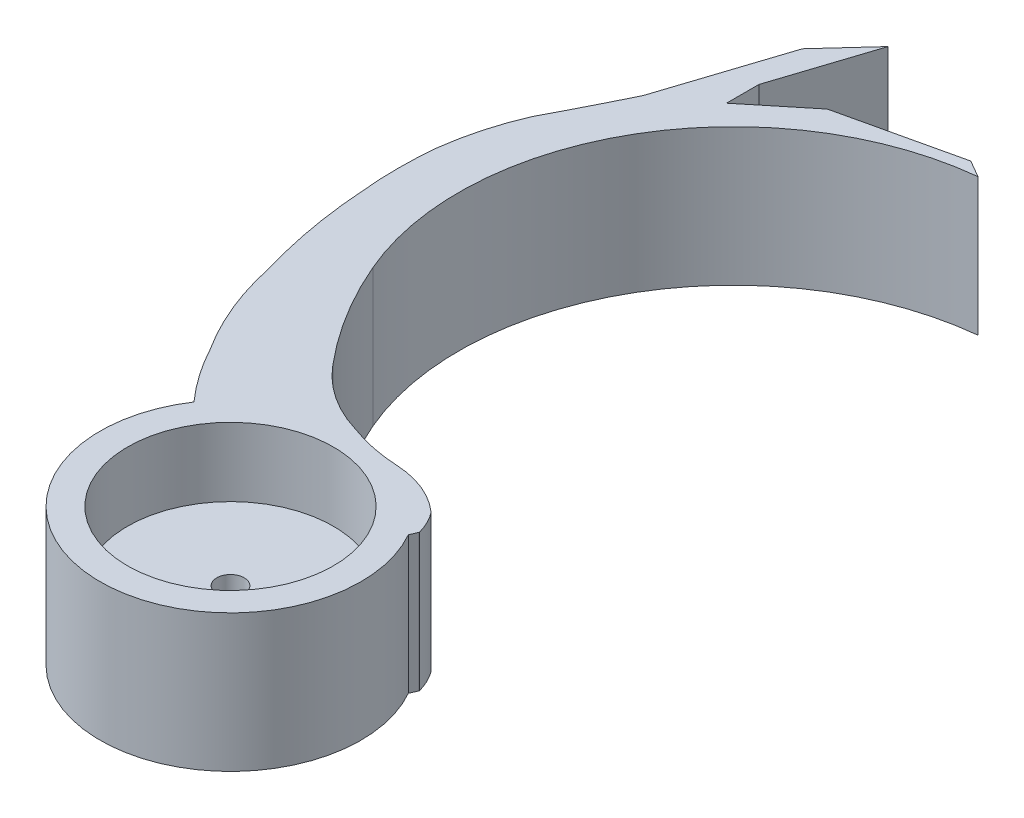
ISO-10303-21;
HEADER;
FILE_DESCRIPTION(('STEP AP214'),'2;1');
FILE_NAME('part.step','',(''),(''),'','','');
FILE_SCHEMA(('AUTOMOTIVE_DESIGN { 1 0 10303 214 1 1 1 1 }'));
ENDSEC;
DATA;
#1=APPLICATION_CONTEXT('core data for automotive mechanical design processes');
#2=APPLICATION_PROTOCOL_DEFINITION('international standard','automotive_design',2000,#1);
#3=PRODUCT_CONTEXT('',#1,'mechanical');
#4=PRODUCT('Part','Part','',(#3));
#5=PRODUCT_RELATED_PRODUCT_CATEGORY('part','',(#4));
#6=PRODUCT_DEFINITION_FORMATION('','',#4);
#7=PRODUCT_DEFINITION_CONTEXT('part definition',#1,'design');
#8=PRODUCT_DEFINITION('design','',#6,#7);
#9=PRODUCT_DEFINITION_SHAPE('','',#8);
#10=(LENGTH_UNIT() NAMED_UNIT(*) SI_UNIT(.MILLI.,.METRE.));
#11=(NAMED_UNIT(*) PLANE_ANGLE_UNIT() SI_UNIT($,.RADIAN.));
#12=(NAMED_UNIT(*) SI_UNIT($,.STERADIAN.) SOLID_ANGLE_UNIT());
#13=UNCERTAINTY_MEASURE_WITH_UNIT(LENGTH_MEASURE(1.E-05),#10,'distance_accuracy_value','');
#14=(GEOMETRIC_REPRESENTATION_CONTEXT(3) GLOBAL_UNCERTAINTY_ASSIGNED_CONTEXT((#13)) GLOBAL_UNIT_ASSIGNED_CONTEXT((#10,
#11,#12)) REPRESENTATION_CONTEXT('',''));
#15=CARTESIAN_POINT('',(0.,0.,0.));
#16=DIRECTION('',(0.,0.,1.));
#17=DIRECTION('',(1.,0.,0.));
#18=AXIS2_PLACEMENT_3D('',#15,#16,#17);
#19=CARTESIAN_POINT('',(-12.8437990591443,10.,27.2611896073278));
#20=DIRECTION('',(0.,-1.,0.));
#21=DIRECTION('',(0.,0.,-1.));
#22=AXIS2_PLACEMENT_3D('',#19,#20,#21);
#23=CYLINDRICAL_SURFACE('',#22,1.);
#24=CARTESIAN_POINT('',(-12.8437990591443,0.,27.2611896073278));
#25=DIRECTION('',(0.,1.,0.));
#26=DIRECTION('',(0.,0.,1.));
#27=AXIS2_PLACEMENT_3D('',#24,#25,#26);
#28=CIRCLE('',#27,1.);
#29=CARTESIAN_POINT('',(-12.8437990591443,0.,28.2611896073278));
#30=VERTEX_POINT('',#29);
#31=EDGE_CURVE('E261',#30,#30,#28,.T.);
#32=ORIENTED_EDGE('',*,*,#31,.F.);
#33=EDGE_LOOP('',(#32));
#34=FACE_BOUND('',#33,.T.);
#35=CARTESIAN_POINT('',(-12.8437990591443,5.,27.2611896073278));
#36=DIRECTION('',(0.,1.,0.));
#37=DIRECTION('',(0.,0.,1.));
#38=AXIS2_PLACEMENT_3D('',#35,#36,#37);
#39=CIRCLE('',#38,1.);
#40=CARTESIAN_POINT('',(-12.8437990591443,5.,28.2611896073278));
#41=VERTEX_POINT('',#40);
#42=EDGE_CURVE('E39',#41,#41,#39,.T.);
#43=ORIENTED_EDGE('',*,*,#42,.T.);
#44=EDGE_LOOP('',(#43));
#45=FACE_BOUND('',#44,.T.);
#46=ADVANCED_FACE('F35',(#34,#45),#23,.F.);
#47=CARTESIAN_POINT('',(-20.2142413349629,10.,0.));
#48=DIRECTION('',(1.,0.,0.));
#49=DIRECTION('',(0.,0.,-1.));
#50=AXIS2_PLACEMENT_3D('',#47,#48,#49);
#51=PLANE('',#50);
#52=DIRECTION('',(0.,0.,1.));
#53=VECTOR('',#52,1.);
#54=CARTESIAN_POINT('',(-20.2142413349629,0.,0.));
#55=LINE('',#54,#53);
#56=CARTESIAN_POINT('',(-20.2142413349629,0.,-18.5820088699334));
#57=VERTEX_POINT('',#56);
#58=CARTESIAN_POINT('',(-20.2142413349629,0.,-16.2231725935429));
#59=VERTEX_POINT('',#58);
#60=EDGE_CURVE('E213',#57,#59,#55,.T.);
#61=ORIENTED_EDGE('',*,*,#60,.F.);
#62=DIRECTION('',(0.,-1.,0.));
#63=VECTOR('',#62,1.);
#64=CARTESIAN_POINT('',(-20.2142413349629,10.,-18.5820088699334));
#65=LINE('',#64,#63);
#66=CARTESIAN_POINT('',(-20.2142413349629,10.,-18.5820088699334));
#67=VERTEX_POINT('',#66);
#68=EDGE_CURVE('E11',#67,#57,#65,.T.);
#69=ORIENTED_EDGE('',*,*,#68,.F.);
#70=DIRECTION('',(0.,0.,1.));
#71=VECTOR('',#70,1.);
#72=CARTESIAN_POINT('',(-20.2142413349629,10.,0.));
#73=LINE('',#72,#71);
#74=CARTESIAN_POINT('',(-20.2142413349629,10.,-16.2231725935429));
#75=VERTEX_POINT('',#74);
#76=EDGE_CURVE('E264',#67,#75,#73,.T.);
#77=ORIENTED_EDGE('',*,*,#76,.T.);
#78=DIRECTION('',(0.,-1.,0.));
#79=VECTOR('',#78,1.);
#80=CARTESIAN_POINT('',(-20.2142413349629,10.,-16.2231725935429));
#81=LINE('',#80,#79);
#82=EDGE_CURVE('E129',#75,#59,#81,.T.);
#83=ORIENTED_EDGE('',*,*,#82,.T.);
#84=EDGE_LOOP('',(#61,#69,#77,#83));
#85=FACE_BOUND('',#84,.T.);
#86=ADVANCED_FACE('F37',(#85),#51,.T.);
#87=CARTESIAN_POINT('',(-23.7471866779469,10.,-7.73368275087385));
#88=DIRECTION('',(0.9508473764207,0.,0.30965992112941));
#89=DIRECTION('',(0.30965992112941,0.,-0.9508473764207));
#90=AXIS2_PLACEMENT_3D('',#87,#88,#89);
#91=PLANE('',#90);
#92=DIRECTION('',(-0.30965992112941,0.,0.9508473764207));
#93=VECTOR('',#92,1.);
#94=CARTESIAN_POINT('',(-23.7471866779469,0.,-7.73368275087385));
#95=LINE('',#94,#93);
#96=CARTESIAN_POINT('',(-17.9037086364288,0.,-25.676772527182));
#97=VERTEX_POINT('',#96);
#98=EDGE_CURVE('E216',#97,#57,#95,.T.);
#99=ORIENTED_EDGE('',*,*,#98,.F.);
#100=DIRECTION('',(0.,-1.,0.));
#101=VECTOR('',#100,1.);
#102=CARTESIAN_POINT('',(-17.9037086364288,10.,-25.676772527182));
#103=LINE('',#102,#101);
#104=CARTESIAN_POINT('',(-17.9037086364288,10.,-25.676772527182));
#105=VERTEX_POINT('',#104);
#106=EDGE_CURVE('E45',#105,#97,#103,.T.);
#107=ORIENTED_EDGE('',*,*,#106,.F.);
#108=DIRECTION('',(-0.30965992112941,0.,0.9508473764207));
#109=VECTOR('',#108,1.);
#110=CARTESIAN_POINT('',(-23.7471866779469,10.,-7.73368275087385));
#111=LINE('',#110,#109);
#112=EDGE_CURVE('E330',#105,#67,#111,.T.);
#113=ORIENTED_EDGE('',*,*,#112,.T.);
#114=ORIENTED_EDGE('',*,*,#68,.T.);
#115=EDGE_LOOP('',(#99,#107,#113,#114));
#116=FACE_BOUND('',#115,.T.);
#117=ADVANCED_FACE('F329',(#116),#91,.T.);
#118=CARTESIAN_POINT('',(-22.5451132045827,10.,-20.5961675466554));
#119=DIRECTION('',(0.738297960081065,0.,0.674474700889617));
#120=DIRECTION('',(0.674474700889617,0.,-0.738297960081065));
#121=AXIS2_PLACEMENT_3D('',#118,#119,#120);
#122=PLANE('',#121);
#123=DIRECTION('',(-0.674474700889617,0.,0.738297960081065));
#124=VECTOR('',#123,1.);
#125=CARTESIAN_POINT('',(-22.5451132045827,0.,-20.5961675466554));
#126=LINE('',#125,#124);
#127=CARTESIAN_POINT('',(-20.8793273548735,0.,-22.4195810759546));
#128=VERTEX_POINT('',#127);
#129=EDGE_CURVE('E219',#97,#128,#126,.T.);
#130=ORIENTED_EDGE('',*,*,#129,.T.);
#131=DIRECTION('',(0.,-1.,0.));
#132=VECTOR('',#131,1.);
#133=CARTESIAN_POINT('',(-20.8793273548735,10.,-22.4195810759546));
#134=LINE('',#133,#132);
#135=CARTESIAN_POINT('',(-20.8793273548735,10.,-22.4195810759546));
#136=VERTEX_POINT('',#135);
#137=EDGE_CURVE('E311',#136,#128,#134,.T.);
#138=ORIENTED_EDGE('',*,*,#137,.F.);
#139=DIRECTION('',(-0.674474700889617,0.,0.738297960081065));
#140=VECTOR('',#139,1.);
#141=CARTESIAN_POINT('',(-22.5451132045827,10.,-20.5961675466554));
#142=LINE('',#141,#140);
#143=EDGE_CURVE('E319',#105,#136,#142,.T.);
#144=ORIENTED_EDGE('',*,*,#143,.F.);
#145=ORIENTED_EDGE('',*,*,#106,.T.);
#146=EDGE_LOOP('',(#130,#138,#144,#145));
#147=FACE_BOUND('',#146,.T.);
#148=ADVANCED_FACE('F317',(#147),#122,.F.);
#149=CARTESIAN_POINT('',(-25.4784302516431,10.,-8.29749221365467));
#150=DIRECTION('',(0.950847376420703,0.,0.309659921129401));
#151=DIRECTION('',(0.309659921129401,0.,-0.950847376420702));
#152=AXIS2_PLACEMENT_3D('',#149,#150,#151);
#153=PLANE('',#152);
#154=DIRECTION('',(-0.309659921129401,0.,0.950847376420703));
#155=VECTOR('',#154,1.);
#156=CARTESIAN_POINT('',(-25.4784302516431,0.,-8.29749221365467));
#157=LINE('',#156,#155);
#158=CARTESIAN_POINT('',(-23.7260144435206,0.,-13.678492013287));
#159=VERTEX_POINT('',#158);
#160=EDGE_CURVE('E221',#128,#159,#157,.T.);
#161=ORIENTED_EDGE('',*,*,#160,.T.);
#162=DIRECTION('',(0.,-1.,0.));
#163=VECTOR('',#162,1.);
#164=CARTESIAN_POINT('',(-23.7260144435206,10.,-13.678492013287));
#165=LINE('',#164,#163);
#166=CARTESIAN_POINT('',(-23.7260144435206,10.,-13.678492013287));
#167=VERTEX_POINT('',#166);
#168=EDGE_CURVE('E308',#167,#159,#165,.T.);
#169=ORIENTED_EDGE('',*,*,#168,.F.);
#170=DIRECTION('',(-0.309659921129401,0.,0.950847376420703));
#171=VECTOR('',#170,1.);
#172=CARTESIAN_POINT('',(-25.4784302516431,10.,-8.29749221365467));
#173=LINE('',#172,#171);
#174=EDGE_CURVE('E339',#136,#167,#173,.T.);
#175=ORIENTED_EDGE('',*,*,#174,.F.);
#176=ORIENTED_EDGE('',*,*,#137,.T.);
#177=EDGE_LOOP('',(#161,#169,#175,#176));
#178=FACE_BOUND('',#177,.T.);
#179=ADVANCED_FACE('F443',(#178),#153,.F.);
#180=CARTESIAN_POINT('',(-176.392216070509,10.,-87.6034124748544));
#181=DIRECTION('',(0.,-1.,0.));
#182=DIRECTION('',(0.,0.,-1.));
#183=AXIS2_PLACEMENT_3D('',#180,#181,#182);
#184=CYLINDRICAL_SURFACE('',#183,169.622707750057);
#185=CARTESIAN_POINT('',(-176.392216070509,0.,-87.6034124748544));
#186=DIRECTION('',(0.,1.,0.));
#187=DIRECTION('',(0.,0.,1.));
#188=AXIS2_PLACEMENT_3D('',#185,#186,#187);
#189=CIRCLE('',#188,169.622707750057);
#190=CARTESIAN_POINT('',(-26.4444092567074,0.,-8.30953997393434));
#191=VERTEX_POINT('',#190);
#192=EDGE_CURVE('E223',#159,#191,#189,.F.);
#193=ORIENTED_EDGE('',*,*,#192,.T.);
#194=DIRECTION('',(0.,-1.,0.));
#195=VECTOR('',#194,1.);
#196=CARTESIAN_POINT('',(-26.4444092567074,10.,-8.30953997393434));
#197=LINE('',#196,#195);
#198=CARTESIAN_POINT('',(-26.4444092567074,10.,-8.30953997393434));
#199=VERTEX_POINT('',#198);
#200=EDGE_CURVE('E305',#199,#191,#197,.T.);
#201=ORIENTED_EDGE('',*,*,#200,.F.);
#202=CARTESIAN_POINT('',(-176.392216070509,10.,-87.6034124748544));
#203=DIRECTION('',(0.,1.,0.));
#204=DIRECTION('',(0.,0.,1.));
#205=AXIS2_PLACEMENT_3D('',#202,#203,#204);
#206=CIRCLE('',#205,169.622707750057);
#207=EDGE_CURVE('E341',#167,#199,#206,.F.);
#208=ORIENTED_EDGE('',*,*,#207,.F.);
#209=ORIENTED_EDGE('',*,*,#168,.T.);
#210=EDGE_LOOP('',(#193,#201,#208,#209));
#211=FACE_BOUND('',#210,.T.);
#212=ADVANCED_FACE('F438',(#211),#184,.F.);
#213=CARTESIAN_POINT('',(-7.95665330887578,10.,-0.323804662988942));
#214=DIRECTION('',(0.,-1.,0.));
#215=DIRECTION('',(0.,0.,-1.));
#216=AXIS2_PLACEMENT_3D('',#213,#214,#215);
#217=CYLINDRICAL_SURFACE('',#216,20.1387459501098);
#218=CARTESIAN_POINT('',(-7.95665330887578,0.,-0.323804662988942));
#219=DIRECTION('',(0.,1.,0.));
#220=DIRECTION('',(0.,0.,1.));
#221=AXIS2_PLACEMENT_3D('',#218,#219,#220);
#222=CIRCLE('',#221,20.1387459501098);
#223=CARTESIAN_POINT('',(-27.9369455661082,0.,-2.8451157819588));
#224=VERTEX_POINT('',#223);
#225=EDGE_CURVE('E225',#191,#224,#222,.T.);
#226=ORIENTED_EDGE('',*,*,#225,.T.);
#227=DIRECTION('',(0.,-1.,0.));
#228=VECTOR('',#227,1.);
#229=CARTESIAN_POINT('',(-27.9369455661082,10.,-2.8451157819588));
#230=LINE('',#229,#228);
#231=CARTESIAN_POINT('',(-27.9369455661082,10.,-2.8451157819588));
#232=VERTEX_POINT('',#231);
#233=EDGE_CURVE('E302',#232,#224,#230,.T.);
#234=ORIENTED_EDGE('',*,*,#233,.F.);
#235=CARTESIAN_POINT('',(-7.95665330887578,10.,-0.323804662988942));
#236=DIRECTION('',(0.,1.,0.));
#237=DIRECTION('',(0.,0.,1.));
#238=AXIS2_PLACEMENT_3D('',#235,#236,#237);
#239=CIRCLE('',#238,20.1387459501098);
#240=EDGE_CURVE('E343',#199,#232,#239,.T.);
#241=ORIENTED_EDGE('',*,*,#240,.F.);
#242=ORIENTED_EDGE('',*,*,#200,.T.);
#243=EDGE_LOOP('',(#226,#234,#241,#242));
#244=FACE_BOUND('',#243,.T.);
#245=ADVANCED_FACE('F435',(#244),#217,.T.);
#246=CARTESIAN_POINT('',(-0.916574408994741,10.,-0.180490640112039));
#247=DIRECTION('',(0.,-1.,0.));
#248=DIRECTION('',(0.,0.,-1.));
#249=AXIS2_PLACEMENT_3D('',#246,#247,#248);
#250=CYLINDRICAL_SURFACE('',#249,27.1514398258129);
#251=CARTESIAN_POINT('',(-0.916574408994741,0.,-0.180490640112039));
#252=DIRECTION('',(0.,1.,0.));
#253=DIRECTION('',(0.,0.,1.));
#254=AXIS2_PLACEMENT_3D('',#251,#252,#253);
#255=CIRCLE('',#254,27.1514398258129);
#256=CARTESIAN_POINT('',(-27.9369455661084,0.,2.48413450173422));
#257=VERTEX_POINT('',#256);
#258=EDGE_CURVE('E227',#224,#257,#255,.T.);
#259=ORIENTED_EDGE('',*,*,#258,.T.);
#260=DIRECTION('',(0.,-1.,0.));
#261=VECTOR('',#260,1.);
#262=CARTESIAN_POINT('',(-27.9369455661084,10.,2.48413450173422));
#263=LINE('',#262,#261);
#264=CARTESIAN_POINT('',(-27.9369455661084,10.,2.48413450173422));
#265=VERTEX_POINT('',#264);
#266=EDGE_CURVE('E299',#265,#257,#263,.T.);
#267=ORIENTED_EDGE('',*,*,#266,.F.);
#268=CARTESIAN_POINT('',(-0.916574408994741,10.,-0.180490640112039));
#269=DIRECTION('',(0.,1.,0.));
#270=DIRECTION('',(0.,0.,1.));
#271=AXIS2_PLACEMENT_3D('',#268,#269,#270);
#272=CIRCLE('',#271,27.1514398258129);
#273=EDGE_CURVE('E345',#232,#265,#272,.T.);
#274=ORIENTED_EDGE('',*,*,#273,.F.);
#275=ORIENTED_EDGE('',*,*,#233,.T.);
#276=EDGE_LOOP('',(#259,#267,#274,#275));
#277=FACE_BOUND('',#276,.T.);
#278=ADVANCED_FACE('F431',(#277),#250,.T.);
#279=CARTESIAN_POINT('',(10.0269760816482,10.,0.0435951776764512));
#280=DIRECTION('',(0.,-1.,0.));
#281=DIRECTION('',(0.,0.,-1.));
#282=AXIS2_PLACEMENT_3D('',#279,#280,#281);
#283=CYLINDRICAL_SURFACE('',#282,38.0422867223999);
#284=CARTESIAN_POINT('',(10.0269760816482,0.,0.0435951776764512));
#285=DIRECTION('',(0.,1.,0.));
#286=DIRECTION('',(0.,0.,1.));
#287=AXIS2_PLACEMENT_3D('',#284,#285,#286);
#288=CIRCLE('',#287,38.0422867223999);
#289=CARTESIAN_POINT('',(-26.4444092567078,0.,10.8627277940387));
#290=VERTEX_POINT('',#289);
#291=EDGE_CURVE('E229',#257,#290,#288,.T.);
#292=ORIENTED_EDGE('',*,*,#291,.T.);
#293=DIRECTION('',(0.,-1.,0.));
#294=VECTOR('',#293,1.);
#295=CARTESIAN_POINT('',(-26.4444092567078,10.,10.8627277940387));
#296=LINE('',#295,#294);
#297=CARTESIAN_POINT('',(-26.4444092567078,10.,10.8627277940387));
#298=VERTEX_POINT('',#297);
#299=EDGE_CURVE('E296',#298,#290,#296,.T.);
#300=ORIENTED_EDGE('',*,*,#299,.F.);
#301=CARTESIAN_POINT('',(10.0269760816482,10.,0.0435951776764512));
#302=DIRECTION('',(0.,1.,0.));
#303=DIRECTION('',(0.,0.,1.));
#304=AXIS2_PLACEMENT_3D('',#301,#302,#303);
#305=CIRCLE('',#304,38.0422867223999);
#306=EDGE_CURVE('E347',#265,#298,#305,.T.);
#307=ORIENTED_EDGE('',*,*,#306,.F.);
#308=ORIENTED_EDGE('',*,*,#266,.T.);
#309=EDGE_LOOP('',(#292,#300,#307,#308));
#310=FACE_BOUND('',#309,.T.);
#311=ADVANCED_FACE('F426',(#310),#283,.T.);
#312=CARTESIAN_POINT('',(-5.33895266715763,10.,6.45705183034006));
#313=DIRECTION('',(0.,-1.,0.));
#314=DIRECTION('',(0.,0.,-1.));
#315=AXIS2_PLACEMENT_3D('',#312,#313,#314);
#316=CYLINDRICAL_SURFACE('',#315,21.5603867903734);
#317=CARTESIAN_POINT('',(-5.33895266715763,0.,6.45705183034006));
#318=DIRECTION('',(0.,1.,0.));
#319=DIRECTION('',(0.,0.,1.));
#320=AXIS2_PLACEMENT_3D('',#317,#318,#319);
#321=CIRCLE('',#320,21.5603867903734);
#322=CARTESIAN_POINT('',(-23.488374838759,0.,18.0952971185049));
#323=VERTEX_POINT('',#322);
#324=EDGE_CURVE('E231',#290,#323,#321,.T.);
#325=ORIENTED_EDGE('',*,*,#324,.T.);
#326=DIRECTION('',(0.,-1.,0.));
#327=VECTOR('',#326,1.);
#328=CARTESIAN_POINT('',(-23.488374838759,10.,18.0952971185049));
#329=LINE('',#328,#327);
#330=CARTESIAN_POINT('',(-23.488374838759,10.,18.0952971185049));
#331=VERTEX_POINT('',#330);
#332=EDGE_CURVE('E293',#331,#323,#329,.T.);
#333=ORIENTED_EDGE('',*,*,#332,.F.);
#334=CARTESIAN_POINT('',(-5.33895266715763,10.,6.45705183034006));
#335=DIRECTION('',(0.,1.,0.));
#336=DIRECTION('',(0.,0.,1.));
#337=AXIS2_PLACEMENT_3D('',#334,#335,#336);
#338=CIRCLE('',#337,21.5603867903734);
#339=EDGE_CURVE('E349',#298,#331,#338,.T.);
#340=ORIENTED_EDGE('',*,*,#339,.F.);
#341=ORIENTED_EDGE('',*,*,#299,.T.);
#342=EDGE_LOOP('',(#325,#333,#340,#341));
#343=FACE_BOUND('',#342,.T.);
#344=ADVANCED_FACE('F420',(#343),#316,.T.);
#345=CARTESIAN_POINT('',(-5.56875548128325,10.,8.49444290633343));
#346=DIRECTION('',(0.,-1.,0.));
#347=DIRECTION('',(0.,0.,-1.));
#348=AXIS2_PLACEMENT_3D('',#345,#346,#347);
#349=CYLINDRICAL_SURFACE('',#348,20.3295144929773);
#350=CARTESIAN_POINT('',(-5.56875548128325,0.,8.49444290633343));
#351=DIRECTION('',(0.,1.,0.));
#352=DIRECTION('',(0.,0.,1.));
#353=AXIS2_PLACEMENT_3D('',#350,#351,#352);
#354=CIRCLE('',#353,20.3295144929773);
#355=CARTESIAN_POINT('',(-20.7581369778164,0.,22.0063579916554));
#356=VERTEX_POINT('',#355);
#357=EDGE_CURVE('E233',#323,#356,#354,.T.);
#358=ORIENTED_EDGE('',*,*,#357,.T.);
#359=DIRECTION('',(0.,-1.,0.));
#360=VECTOR('',#359,1.);
#361=CARTESIAN_POINT('',(-20.7581369778164,10.,22.0063579916554));
#362=LINE('',#361,#360);
#363=CARTESIAN_POINT('',(-20.7581369778164,10.,22.0063579916554));
#364=VERTEX_POINT('',#363);
#365=EDGE_CURVE('E290',#364,#356,#362,.T.);
#366=ORIENTED_EDGE('',*,*,#365,.F.);
#367=CARTESIAN_POINT('',(-5.56875548128325,10.,8.49444290633343));
#368=DIRECTION('',(0.,1.,0.));
#369=DIRECTION('',(0.,0.,1.));
#370=AXIS2_PLACEMENT_3D('',#367,#368,#369);
#371=CIRCLE('',#370,20.3295144929773);
#372=EDGE_CURVE('E351',#331,#364,#371,.T.);
#373=ORIENTED_EDGE('',*,*,#372,.F.);
#374=ORIENTED_EDGE('',*,*,#332,.T.);
#375=EDGE_LOOP('',(#358,#366,#373,#374));
#376=FACE_BOUND('',#375,.T.);
#377=ADVANCED_FACE('F416',(#376),#349,.T.);
#378=CARTESIAN_POINT('',(-12.8437990591443,10.,27.2611896073278));
#379=DIRECTION('',(0.,-1.,0.));
#380=DIRECTION('',(0.,0.,-1.));
#381=AXIS2_PLACEMENT_3D('',#378,#379,#380);
#382=CYLINDRICAL_SURFACE('',#381,9.5);
#383=CARTESIAN_POINT('',(-12.8437990591443,0.,27.2611896073278));
#384=DIRECTION('',(0.,1.,0.));
#385=DIRECTION('',(0.,0.,1.));
#386=AXIS2_PLACEMENT_3D('',#383,#384,#385);
#387=CIRCLE('',#386,9.5);
#388=CARTESIAN_POINT('',(-4.58227795542284,0.,22.5710649764928));
#389=VERTEX_POINT('',#388);
#390=EDGE_CURVE('E235',#356,#389,#387,.T.);
#391=ORIENTED_EDGE('',*,*,#390,.T.);
#392=DIRECTION('',(0.,-1.,0.));
#393=VECTOR('',#392,1.);
#394=CARTESIAN_POINT('',(-4.58227795542284,10.,22.5710649764928));
#395=LINE('',#394,#393);
#396=CARTESIAN_POINT('',(-4.58227795542284,10.,22.5710649764928));
#397=VERTEX_POINT('',#396);
#398=EDGE_CURVE('E288',#397,#389,#395,.T.);
#399=ORIENTED_EDGE('',*,*,#398,.F.);
#400=CARTESIAN_POINT('',(-12.8437990591443,10.,27.2611896073278));
#401=DIRECTION('',(0.,1.,0.));
#402=DIRECTION('',(0.,0.,1.));
#403=AXIS2_PLACEMENT_3D('',#400,#401,#402);
#404=CIRCLE('',#403,9.5);
#405=EDGE_CURVE('E353',#364,#397,#404,.T.);
#406=ORIENTED_EDGE('',*,*,#405,.F.);
#407=ORIENTED_EDGE('',*,*,#365,.T.);
#408=EDGE_LOOP('',(#391,#399,#406,#407));
#409=FACE_BOUND('',#408,.T.);
#410=ADVANCED_FACE('F411',(#409),#382,.T.);
#411=CARTESIAN_POINT('',(-16.7025769365448,10.,16.9703090290826));
#412=DIRECTION('',(0.,-1.,0.));
#413=DIRECTION('',(0.,0.,-1.));
#414=AXIS2_PLACEMENT_3D('',#411,#412,#413);
#415=CYLINDRICAL_SURFACE('',#414,13.3517831982937);
#416=CARTESIAN_POINT('',(-16.7025769365448,0.,16.9703090290826));
#417=DIRECTION('',(0.,1.,0.));
#418=DIRECTION('',(0.,0.,1.));
#419=AXIS2_PLACEMENT_3D('',#416,#417,#418);
#420=CIRCLE('',#419,13.3517831982937);
#421=CARTESIAN_POINT('',(-4.34456964084055,0.,22.0249870854535));
#422=VERTEX_POINT('',#421);
#423=EDGE_CURVE('E238',#422,#389,#420,.F.);
#424=ORIENTED_EDGE('',*,*,#423,.F.);
#425=DIRECTION('',(0.,-1.,0.));
#426=VECTOR('',#425,1.);
#427=CARTESIAN_POINT('',(-4.34456964084055,10.,22.0249870854535));
#428=LINE('',#427,#426);
#429=CARTESIAN_POINT('',(-4.34456964084055,10.,22.0249870854535));
#430=VERTEX_POINT('',#429);
#431=EDGE_CURVE('E286',#430,#422,#428,.T.);
#432=ORIENTED_EDGE('',*,*,#431,.F.);
#433=CARTESIAN_POINT('',(-16.7025769365448,10.,16.9703090290826));
#434=DIRECTION('',(0.,1.,0.));
#435=DIRECTION('',(0.,0.,1.));
#436=AXIS2_PLACEMENT_3D('',#433,#434,#435);
#437=CIRCLE('',#436,13.3517831982937);
#438=EDGE_CURVE('E355',#430,#397,#437,.F.);
#439=ORIENTED_EDGE('',*,*,#438,.T.);
#440=ORIENTED_EDGE('',*,*,#398,.T.);
#441=EDGE_LOOP('',(#424,#432,#439,#440));
#442=FACE_BOUND('',#441,.T.);
#443=ADVANCED_FACE('F405',(#442),#415,.T.);
#444=CARTESIAN_POINT('',(0.367767222361646,10.,23.2869671122719));
#445=DIRECTION('',(0.,-1.,0.));
#446=DIRECTION('',(0.,0.,-1.));
#447=AXIS2_PLACEMENT_3D('',#444,#445,#446);
#448=CYLINDRICAL_SURFACE('',#447,4.8783923889313);
#449=CARTESIAN_POINT('',(0.367767222361646,0.,23.2869671122719));
#450=DIRECTION('',(0.,1.,0.));
#451=DIRECTION('',(0.,0.,1.));
#452=AXIS2_PLACEMENT_3D('',#449,#450,#451);
#453=CIRCLE('',#452,4.8783923889313);
#454=CARTESIAN_POINT('',(-4.33738459962014,0.,21.9984568746392));
#455=VERTEX_POINT('',#454);
#456=EDGE_CURVE('E241',#422,#455,#453,.F.);
#457=ORIENTED_EDGE('',*,*,#456,.T.);
#458=DIRECTION('',(0.,-1.,0.));
#459=VECTOR('',#458,1.);
#460=CARTESIAN_POINT('',(-4.33738459962014,10.,21.9984568746392));
#461=LINE('',#460,#459);
#462=CARTESIAN_POINT('',(-4.33738459962014,10.,21.9984568746392));
#463=VERTEX_POINT('',#462);
#464=EDGE_CURVE('E283',#463,#455,#461,.T.);
#465=ORIENTED_EDGE('',*,*,#464,.F.);
#466=CARTESIAN_POINT('',(0.367767222361646,10.,23.2869671122719));
#467=DIRECTION('',(0.,1.,0.));
#468=DIRECTION('',(0.,0.,1.));
#469=AXIS2_PLACEMENT_3D('',#466,#467,#468);
#470=CIRCLE('',#469,4.8783923889313);
#471=EDGE_CURVE('E358',#430,#463,#470,.F.);
#472=ORIENTED_EDGE('',*,*,#471,.F.);
#473=ORIENTED_EDGE('',*,*,#431,.T.);
#474=EDGE_LOOP('',(#457,#465,#472,#473));
#475=FACE_BOUND('',#474,.T.);
#476=ADVANCED_FACE('F402',(#475),#448,.F.);
#477=CARTESIAN_POINT('',(-9.04253642160193,10.,23.2869671122719));
#478=DIRECTION('',(0.,-1.,0.));
#479=DIRECTION('',(0.,0.,-1.));
#480=AXIS2_PLACEMENT_3D('',#477,#478,#479);
#481=CYLINDRICAL_SURFACE('',#480,4.8783923889313);
#482=CARTESIAN_POINT('',(-9.04253642160193,0.,23.2869671122719));
#483=DIRECTION('',(0.,1.,0.));
#484=DIRECTION('',(0.,0.,1.));
#485=AXIS2_PLACEMENT_3D('',#482,#483,#484);
#486=CIRCLE('',#485,4.8783923889313);
#487=CARTESIAN_POINT('',(-5.15548157923228,0.,20.3391684500845));
#488=VERTEX_POINT('',#487);
#489=EDGE_CURVE('E243',#455,#488,#486,.T.);
#490=ORIENTED_EDGE('',*,*,#489,.T.);
#491=DIRECTION('',(0.,-1.,0.));
#492=VECTOR('',#491,1.);
#493=CARTESIAN_POINT('',(-5.15548157923228,10.,20.3391684500845));
#494=LINE('',#493,#492);
#495=CARTESIAN_POINT('',(-5.15548157923228,10.,20.3391684500845));
#496=VERTEX_POINT('',#495);
#497=EDGE_CURVE('E280',#496,#488,#494,.T.);
#498=ORIENTED_EDGE('',*,*,#497,.F.);
#499=CARTESIAN_POINT('',(-9.04253642160193,10.,23.2869671122719));
#500=DIRECTION('',(0.,1.,0.));
#501=DIRECTION('',(0.,0.,1.));
#502=AXIS2_PLACEMENT_3D('',#499,#500,#501);
#503=CIRCLE('',#502,4.8783923889313);
#504=EDGE_CURVE('E360',#463,#496,#503,.T.);
#505=ORIENTED_EDGE('',*,*,#504,.F.);
#506=ORIENTED_EDGE('',*,*,#464,.T.);
#507=EDGE_LOOP('',(#490,#498,#505,#506));
#508=FACE_BOUND('',#507,.T.);
#509=ADVANCED_FACE('F397',(#508),#481,.T.);
#510=CARTESIAN_POINT('',(-9.68977642554818,10.,25.4216520417061));
#511=DIRECTION('',(0.,-1.,0.));
#512=DIRECTION('',(0.,0.,-1.));
#513=AXIS2_PLACEMENT_3D('',#510,#511,#512);
#514=CYLINDRICAL_SURFACE('',#513,6.81112833621782);
#515=CARTESIAN_POINT('',(-9.68977642554818,0.,25.4216520417061));
#516=DIRECTION('',(0.,1.,0.));
#517=DIRECTION('',(0.,0.,1.));
#518=AXIS2_PLACEMENT_3D('',#515,#516,#517);
#519=CIRCLE('',#518,6.81112833621782);
#520=CARTESIAN_POINT('',(-9.36187362615852,0.,18.6184212675385));
#521=VERTEX_POINT('',#520);
#522=EDGE_CURVE('E245',#488,#521,#519,.T.);
#523=ORIENTED_EDGE('',*,*,#522,.T.);
#524=DIRECTION('',(0.,-1.,0.));
#525=VECTOR('',#524,1.);
#526=CARTESIAN_POINT('',(-9.36187362615852,10.,18.6184212675385));
#527=LINE('',#526,#525);
#528=CARTESIAN_POINT('',(-9.36187362615852,10.,18.6184212675385));
#529=VERTEX_POINT('',#528);
#530=EDGE_CURVE('E277',#529,#521,#527,.T.);
#531=ORIENTED_EDGE('',*,*,#530,.F.);
#532=CARTESIAN_POINT('',(-9.68977642554818,10.,25.4216520417061));
#533=DIRECTION('',(0.,1.,0.));
#534=DIRECTION('',(0.,0.,1.));
#535=AXIS2_PLACEMENT_3D('',#532,#533,#534);
#536=CIRCLE('',#535,6.81112833621782);
#537=EDGE_CURVE('E362',#496,#529,#536,.T.);
#538=ORIENTED_EDGE('',*,*,#537,.F.);
#539=ORIENTED_EDGE('',*,*,#497,.T.);
#540=EDGE_LOOP('',(#523,#531,#538,#539));
#541=FACE_BOUND('',#540,.T.);
#542=ADVANCED_FACE('F391',(#541),#514,.T.);
#543=CARTESIAN_POINT('',(-8.75284450671184,10.,5.98246434525499));
#544=DIRECTION('',(0.,-1.,0.));
#545=DIRECTION('',(0.,0.,-1.));
#546=AXIS2_PLACEMENT_3D('',#543,#544,#545);
#547=CYLINDRICAL_SURFACE('',#546,12.65062543158);
#548=CARTESIAN_POINT('',(-8.75284450671184,0.,5.98246434525499));
#549=DIRECTION('',(0.,1.,0.));
#550=DIRECTION('',(0.,0.,1.));
#551=AXIS2_PLACEMENT_3D('',#548,#549,#550);
#552=CIRCLE('',#551,12.65062543158);
#553=CARTESIAN_POINT('',(-13.1501888783321,0.,17.8442385079811));
#554=VERTEX_POINT('',#553);
#555=EDGE_CURVE('E247',#521,#554,#552,.F.);
#556=ORIENTED_EDGE('',*,*,#555,.T.);
#557=DIRECTION('',(0.,-1.,0.));
#558=VECTOR('',#557,1.);
#559=CARTESIAN_POINT('',(-13.1501888783321,10.,17.8442385079811));
#560=LINE('',#559,#558);
#561=CARTESIAN_POINT('',(-13.1501888783321,10.,17.8442385079811));
#562=VERTEX_POINT('',#561);
#563=EDGE_CURVE('E274',#562,#554,#560,.T.);
#564=ORIENTED_EDGE('',*,*,#563,.F.);
#565=CARTESIAN_POINT('',(-8.75284450671184,10.,5.98246434525499));
#566=DIRECTION('',(0.,1.,0.));
#567=DIRECTION('',(0.,0.,1.));
#568=AXIS2_PLACEMENT_3D('',#565,#566,#567);
#569=CIRCLE('',#568,12.65062543158);
#570=EDGE_CURVE('E364',#529,#562,#569,.F.);
#571=ORIENTED_EDGE('',*,*,#570,.F.);
#572=ORIENTED_EDGE('',*,*,#530,.T.);
#573=EDGE_LOOP('',(#556,#564,#571,#572));
#574=FACE_BOUND('',#573,.T.);
#575=ADVANCED_FACE('F387',(#574),#547,.F.);
#576=CARTESIAN_POINT('',(-10.3234413087134,10.,8.25695031631017));
#577=DIRECTION('',(0.,-1.,0.));
#578=DIRECTION('',(0.,0.,-1.));
#579=AXIS2_PLACEMENT_3D('',#576,#577,#578);
#580=CYLINDRICAL_SURFACE('',#579,9.99532874359308);
#581=CARTESIAN_POINT('',(-10.3234413087134,0.,8.25695031631017));
#582=DIRECTION('',(0.,1.,0.));
#583=DIRECTION('',(0.,0.,1.));
#584=AXIS2_PLACEMENT_3D('',#581,#582,#583);
#585=CIRCLE('',#584,9.99532874359308);
#586=CARTESIAN_POINT('',(-18.0103683454696,0.,14.6458273243677));
#587=VERTEX_POINT('',#586);
#588=EDGE_CURVE('E249',#554,#587,#585,.F.);
#589=ORIENTED_EDGE('',*,*,#588,.T.);
#590=DIRECTION('',(0.,-1.,0.));
#591=VECTOR('',#590,1.);
#592=CARTESIAN_POINT('',(-18.0103683454696,10.,14.6458273243677));
#593=LINE('',#592,#591);
#594=CARTESIAN_POINT('',(-18.0103683454696,10.,14.6458273243677));
#595=VERTEX_POINT('',#594);
#596=EDGE_CURVE('E271',#595,#587,#593,.T.);
#597=ORIENTED_EDGE('',*,*,#596,.F.);
#598=CARTESIAN_POINT('',(-10.3234413087134,10.,8.25695031631017));
#599=DIRECTION('',(0.,1.,0.));
#600=DIRECTION('',(0.,0.,1.));
#601=AXIS2_PLACEMENT_3D('',#598,#599,#600);
#602=CIRCLE('',#601,9.99532874359308);
#603=EDGE_CURVE('E366',#562,#595,#602,.F.);
#604=ORIENTED_EDGE('',*,*,#603,.F.);
#605=ORIENTED_EDGE('',*,*,#563,.T.);
#606=EDGE_LOOP('',(#589,#597,#604,#605));
#607=FACE_BOUND('',#606,.T.);
#608=ADVANCED_FACE('F383',(#607),#580,.F.);
#609=CARTESIAN_POINT('',(5.13122081313294,10.,-4.91362981829786));
#610=DIRECTION('',(0.,-1.,0.));
#611=DIRECTION('',(0.,0.,-1.));
#612=AXIS2_PLACEMENT_3D('',#609,#610,#611);
#613=CYLINDRICAL_SURFACE('',#612,30.3002559807887);
#614=CARTESIAN_POINT('',(5.13122081313294,0.,-4.91362981829786));
#615=DIRECTION('',(0.,1.,0.));
#616=DIRECTION('',(0.,0.,1.));
#617=AXIS2_PLACEMENT_3D('',#614,#615,#616);
#618=CIRCLE('',#617,30.3002559807887);
#619=CARTESIAN_POINT('',(-22.7225692599108,0.,7.01414830959043));
#620=VERTEX_POINT('',#619);
#621=EDGE_CURVE('E251',#587,#620,#618,.F.);
#622=ORIENTED_EDGE('',*,*,#621,.T.);
#623=DIRECTION('',(0.,-1.,0.));
#624=VECTOR('',#623,1.);
#625=CARTESIAN_POINT('',(-22.7225692599108,10.,7.01414830959043));
#626=LINE('',#625,#624);
#627=CARTESIAN_POINT('',(-22.7225692599108,10.,7.01414830959043));
#628=VERTEX_POINT('',#627);
#629=EDGE_CURVE('E268',#628,#620,#626,.T.);
#630=ORIENTED_EDGE('',*,*,#629,.F.);
#631=CARTESIAN_POINT('',(5.13122081313294,10.,-4.91362981829786));
#632=DIRECTION('',(0.,1.,0.));
#633=DIRECTION('',(0.,0.,1.));
#634=AXIS2_PLACEMENT_3D('',#631,#632,#633);
#635=CIRCLE('',#634,30.3002559807887);
#636=EDGE_CURVE('E368',#595,#628,#635,.F.);
#637=ORIENTED_EDGE('',*,*,#636,.F.);
#638=ORIENTED_EDGE('',*,*,#596,.T.);
#639=EDGE_LOOP('',(#622,#630,#637,#638));
#640=FACE_BOUND('',#639,.T.);
#641=ADVANCED_FACE('F374',(#640),#613,.F.);
#642=CARTESIAN_POINT('',(-4.33738459962014,10.,-0.858906053680229));
#643=DIRECTION('',(0.,-1.,0.));
#644=DIRECTION('',(0.,0.,-1.));
#645=AXIS2_PLACEMENT_3D('',#642,#643,#644);
#646=CYLINDRICAL_SURFACE('',#645,20.);
#647=CARTESIAN_POINT('',(-4.33738459962014,0.,-0.858906053680229));
#648=DIRECTION('',(0.,1.,0.));
#649=DIRECTION('',(0.,0.,1.));
#650=AXIS2_PLACEMENT_3D('',#647,#648,#649);
#651=CIRCLE('',#650,20.);
#652=CARTESIAN_POINT('',(-6.42360323252919,0.,-20.7498007498899));
#653=VERTEX_POINT('',#652);
#654=EDGE_CURVE('E253',#620,#653,#651,.F.);
#655=ORIENTED_EDGE('',*,*,#654,.T.);
#656=DIRECTION('',(0.,-1.,0.));
#657=VECTOR('',#656,1.);
#658=CARTESIAN_POINT('',(-6.42360323252919,10.,-20.7498007498899));
#659=LINE('',#658,#657);
#660=CARTESIAN_POINT('',(-6.42360323252919,10.,-20.7498007498899));
#661=VERTEX_POINT('',#660);
#662=EDGE_CURVE('E200',#661,#653,#659,.T.);
#663=ORIENTED_EDGE('',*,*,#662,.F.);
#664=CARTESIAN_POINT('',(-4.33738459962014,10.,-0.858906053680229));
#665=DIRECTION('',(0.,1.,0.));
#666=DIRECTION('',(0.,0.,1.));
#667=AXIS2_PLACEMENT_3D('',#664,#665,#666);
#668=CIRCLE('',#667,20.);
#669=EDGE_CURVE('E205',#628,#661,#668,.F.);
#670=ORIENTED_EDGE('',*,*,#669,.F.);
#671=ORIENTED_EDGE('',*,*,#629,.T.);
#672=EDGE_LOOP('',(#655,#663,#670,#671));
#673=FACE_BOUND('',#672,.T.);
#674=ADVANCED_FACE('F378',(#673),#646,.F.);
#675=CARTESIAN_POINT('',(7.38557358166856,10.,-12.7518451211485));
#676=DIRECTION('',(0.501184996579342,0.,-0.865340163868386));
#677=DIRECTION('',(-0.865340163868386,0.,-0.501184996579342));
#678=AXIS2_PLACEMENT_3D('',#675,#676,#677);
#679=PLANE('',#678);
#680=DIRECTION('',(0.865340163868386,0.,0.501184996579342));
#681=VECTOR('',#680,1.);
#682=CARTESIAN_POINT('',(7.38557358166856,0.,-12.7518451211485));
#683=LINE('',#682,#681);
#684=CARTESIAN_POINT('',(-7.667855794386,0.,-21.4704430383171));
#685=VERTEX_POINT('',#684);
#686=EDGE_CURVE('E195',#685,#653,#683,.T.);
#687=ORIENTED_EDGE('',*,*,#686,.F.);
#688=DIRECTION('',(0.,-1.,0.));
#689=VECTOR('',#688,1.);
#690=CARTESIAN_POINT('',(-7.667855794386,10.,-21.4704430383171));
#691=LINE('',#690,#689);
#692=CARTESIAN_POINT('',(-7.667855794386,10.,-21.4704430383171));
#693=VERTEX_POINT('',#692);
#694=EDGE_CURVE('E190',#693,#685,#691,.T.);
#695=ORIENTED_EDGE('',*,*,#694,.F.);
#696=DIRECTION('',(0.865340163868386,0.,0.501184996579342));
#697=VECTOR('',#696,1.);
#698=CARTESIAN_POINT('',(7.38557358166856,10.,-12.7518451211485));
#699=LINE('',#698,#697);
#700=EDGE_CURVE('E193',#693,#661,#699,.T.);
#701=ORIENTED_EDGE('',*,*,#700,.T.);
#702=ORIENTED_EDGE('',*,*,#662,.T.);
#703=EDGE_LOOP('',(#687,#695,#701,#702));
#704=FACE_BOUND('',#703,.T.);
#705=ADVANCED_FACE('F192',(#704),#679,.T.);
#706=CARTESIAN_POINT('',(-5.05701892554654,10.,-22.0687131489539));
#707=DIRECTION('',(-0.223359601164946,0.,-0.974736112272156));
#708=DIRECTION('',(-0.974736112272156,0.,0.223359601164946));
#709=AXIS2_PLACEMENT_3D('',#706,#707,#708);
#710=PLANE('',#709);
#711=DIRECTION('',(0.974736112272156,0.,-0.223359601164946));
#712=VECTOR('',#711,1.);
#713=CARTESIAN_POINT('',(-5.05701892554654,0.,-22.0687131489539));
#714=LINE('',#713,#712);
#715=CARTESIAN_POINT('',(-16.1729144901479,0.,-19.5215191252166));
#716=VERTEX_POINT('',#715);
#717=EDGE_CURVE('E257',#716,#685,#714,.T.);
#718=ORIENTED_EDGE('',*,*,#717,.F.);
#719=DIRECTION('',(0.,-1.,0.));
#720=VECTOR('',#719,1.);
#721=CARTESIAN_POINT('',(-16.1729144901479,10.,-19.5215191252166));
#722=LINE('',#721,#720);
#723=CARTESIAN_POINT('',(-16.1729144901479,10.,-19.5215191252166));
#724=VERTEX_POINT('',#723);
#725=EDGE_CURVE('E122',#724,#716,#722,.T.);
#726=ORIENTED_EDGE('',*,*,#725,.F.);
#727=DIRECTION('',(0.974736112272156,0.,-0.223359601164946));
#728=VECTOR('',#727,1.);
#729=CARTESIAN_POINT('',(-5.05701892554654,10.,-22.0687131489539));
#730=LINE('',#729,#728);
#731=EDGE_CURVE('E203',#724,#693,#730,.T.);
#732=ORIENTED_EDGE('',*,*,#731,.T.);
#733=ORIENTED_EDGE('',*,*,#694,.T.);
#734=EDGE_LOOP('',(#718,#726,#732,#733));
#735=FACE_BOUND('',#734,.T.);
#736=ADVANCED_FACE('F208',(#735),#710,.T.);
#737=CARTESIAN_POINT('',(-16.028661226642,10.,-19.6392520554243));
#738=DIRECTION('',(0.632296442931859,0.,0.774726537725227));
#739=DIRECTION('',(0.774726537725227,0.,-0.632296442931859));
#740=AXIS2_PLACEMENT_3D('',#737,#738,#739);
#741=PLANE('',#740);
#742=DIRECTION('',(-0.774726537725227,0.,0.632296442931859));
#743=VECTOR('',#742,1.);
#744=CARTESIAN_POINT('',(-16.028661226642,0.,-19.6392520554243));
#745=LINE('',#744,#743);
#746=EDGE_CURVE('E259',#716,#59,#745,.T.);
#747=ORIENTED_EDGE('',*,*,#746,.T.);
#748=ORIENTED_EDGE('',*,*,#82,.F.);
#749=DIRECTION('',(-0.774726537725227,0.,0.632296442931859));
#750=VECTOR('',#749,1.);
#751=CARTESIAN_POINT('',(-16.028661226642,10.,-19.6392520554243));
#752=LINE('',#751,#750);
#753=EDGE_CURVE('E53',#724,#75,#752,.T.);
#754=ORIENTED_EDGE('',*,*,#753,.F.);
#755=ORIENTED_EDGE('',*,*,#725,.T.);
#756=EDGE_LOOP('',(#747,#748,#754,#755));
#757=FACE_BOUND('',#756,.T.);
#758=ADVANCED_FACE('F331',(#757),#741,.F.);
#759=CARTESIAN_POINT('',(0.,10.,0.));
#760=DIRECTION('',(0.,1.,0.));
#761=DIRECTION('',(0.,0.,1.));
#762=AXIS2_PLACEMENT_3D('',#759,#760,#761);
#763=PLANE('',#762);
#764=CARTESIAN_POINT('',(-12.8437990591443,10.,27.2611896073278));
#765=DIRECTION('',(0.,1.,0.));
#766=DIRECTION('',(0.,0.,1.));
#767=AXIS2_PLACEMENT_3D('',#764,#765,#766);
#768=CIRCLE('',#767,7.5);
#769=CARTESIAN_POINT('',(-12.8437990591443,10.,34.7611896073278));
#770=VERTEX_POINT('',#769);
#771=EDGE_CURVE('E335',#770,#770,#768,.T.);
#772=ORIENTED_EDGE('',*,*,#771,.F.);
#773=EDGE_LOOP('',(#772));
#774=FACE_BOUND('',#773,.T.);
#775=ORIENTED_EDGE('',*,*,#76,.F.);
#776=ORIENTED_EDGE('',*,*,#112,.F.);
#777=ORIENTED_EDGE('',*,*,#143,.T.);
#778=ORIENTED_EDGE('',*,*,#174,.T.);
#779=ORIENTED_EDGE('',*,*,#207,.T.);
#780=ORIENTED_EDGE('',*,*,#240,.T.);
#781=ORIENTED_EDGE('',*,*,#273,.T.);
#782=ORIENTED_EDGE('',*,*,#306,.T.);
#783=ORIENTED_EDGE('',*,*,#339,.T.);
#784=ORIENTED_EDGE('',*,*,#372,.T.);
#785=ORIENTED_EDGE('',*,*,#405,.T.);
#786=ORIENTED_EDGE('',*,*,#438,.F.);
#787=ORIENTED_EDGE('',*,*,#471,.T.);
#788=ORIENTED_EDGE('',*,*,#504,.T.);
#789=ORIENTED_EDGE('',*,*,#537,.T.);
#790=ORIENTED_EDGE('',*,*,#570,.T.);
#791=ORIENTED_EDGE('',*,*,#603,.T.);
#792=ORIENTED_EDGE('',*,*,#636,.T.);
#793=ORIENTED_EDGE('',*,*,#669,.T.);
#794=ORIENTED_EDGE('',*,*,#700,.F.);
#795=ORIENTED_EDGE('',*,*,#731,.F.);
#796=ORIENTED_EDGE('',*,*,#753,.T.);
#797=EDGE_LOOP('',(#775,#776,#777,#778,#779,#780,#781,#782,#783,#784,#785,#786,#787,#788,#789,
#790,#791,#792,#793,#794,#795,#796));
#798=FACE_BOUND('',#797,.T.);
#799=ADVANCED_FACE('F202',(#774,#798),#763,.T.);
#800=CARTESIAN_POINT('',(0.,0.,0.));
#801=DIRECTION('',(0.,1.,0.));
#802=DIRECTION('',(0.,0.,1.));
#803=AXIS2_PLACEMENT_3D('',#800,#801,#802);
#804=PLANE('',#803);
#805=ORIENTED_EDGE('',*,*,#60,.T.);
#806=ORIENTED_EDGE('',*,*,#746,.F.);
#807=ORIENTED_EDGE('',*,*,#717,.T.);
#808=ORIENTED_EDGE('',*,*,#686,.T.);
#809=ORIENTED_EDGE('',*,*,#654,.F.);
#810=ORIENTED_EDGE('',*,*,#621,.F.);
#811=ORIENTED_EDGE('',*,*,#588,.F.);
#812=ORIENTED_EDGE('',*,*,#555,.F.);
#813=ORIENTED_EDGE('',*,*,#522,.F.);
#814=ORIENTED_EDGE('',*,*,#489,.F.);
#815=ORIENTED_EDGE('',*,*,#456,.F.);
#816=ORIENTED_EDGE('',*,*,#423,.T.);
#817=ORIENTED_EDGE('',*,*,#390,.F.);
#818=ORIENTED_EDGE('',*,*,#357,.F.);
#819=ORIENTED_EDGE('',*,*,#324,.F.);
#820=ORIENTED_EDGE('',*,*,#291,.F.);
#821=ORIENTED_EDGE('',*,*,#258,.F.);
#822=ORIENTED_EDGE('',*,*,#225,.F.);
#823=ORIENTED_EDGE('',*,*,#192,.F.);
#824=ORIENTED_EDGE('',*,*,#160,.F.);
#825=ORIENTED_EDGE('',*,*,#129,.F.);
#826=ORIENTED_EDGE('',*,*,#98,.T.);
#827=EDGE_LOOP('',(#805,#806,#807,#808,#809,#810,#811,#812,#813,#814,#815,#816,#817,#818,#819,
#820,#821,#822,#823,#824,#825,#826));
#828=FACE_BOUND('',#827,.T.);
#829=ORIENTED_EDGE('',*,*,#31,.T.);
#830=EDGE_LOOP('',(#829));
#831=FACE_BOUND('',#830,.T.);
#832=ADVANCED_FACE('F326',(#828,#831),#804,.F.);
#833=CARTESIAN_POINT('',(-12.8437990591443,5.,27.2611896073278));
#834=DIRECTION('',(0.,1.,0.));
#835=DIRECTION('',(0.,0.,1.));
#836=AXIS2_PLACEMENT_3D('',#833,#834,#835);
#837=CYLINDRICAL_SURFACE('',#836,7.5);
#838=CARTESIAN_POINT('',(-12.8437990591443,5.,27.2611896073278));
#839=DIRECTION('',(0.,1.,0.));
#840=DIRECTION('',(0.,0.,1.));
#841=AXIS2_PLACEMENT_3D('',#838,#839,#840);
#842=CIRCLE('',#841,7.5);
#843=CARTESIAN_POINT('',(-12.8437990591443,5.,34.7611896073278));
#844=VERTEX_POINT('',#843);
#845=EDGE_CURVE('E692',#844,#844,#842,.T.);
#846=ORIENTED_EDGE('',*,*,#845,.F.);
#847=EDGE_LOOP('',(#846));
#848=FACE_BOUND('',#847,.T.);
#849=ORIENTED_EDGE('',*,*,#771,.T.);
#850=EDGE_LOOP('',(#849));
#851=FACE_BOUND('',#850,.T.);
#852=ADVANCED_FACE('F577',(#848,#851),#837,.F.);
#853=CARTESIAN_POINT('',(-12.8437990591443,5.,27.2611896073278));
#854=DIRECTION('',(0.,1.,0.));
#855=DIRECTION('',(0.,0.,1.));
#856=AXIS2_PLACEMENT_3D('',#853,#854,#855);
#857=PLANE('',#856);
#858=ORIENTED_EDGE('',*,*,#42,.F.);
#859=EDGE_LOOP('',(#858));
#860=FACE_BOUND('',#859,.T.);
#861=ORIENTED_EDGE('',*,*,#845,.T.);
#862=EDGE_LOOP('',(#861));
#863=FACE_BOUND('',#862,.T.);
#864=ADVANCED_FACE('F582',(#860,#863),#857,.T.);
#865=CLOSED_SHELL('',(#46,#86,#117,#148,#179,#212,#245,#278,#311,#344,#377,#410,#443,#476,#509,
#542,#575,#608,#641,#674,#705,#736,#758,#799,#832,#852,#864));
#866=MANIFOLD_SOLID_BREP('B2',#865);
#867=ADVANCED_BREP_SHAPE_REPRESENTATION('',(#18,#866),#14);
#868=SHAPE_DEFINITION_REPRESENTATION(#9,#867);
ENDSEC;
END-ISO-10303-21;
